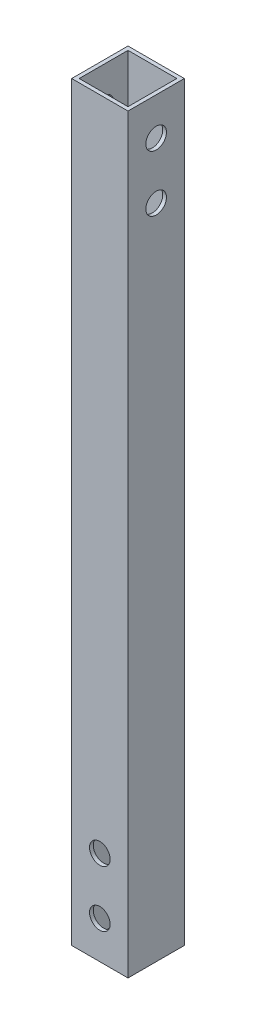
ISO-10303-21;
HEADER;
FILE_DESCRIPTION(('STEP AP214'),'2;1');
FILE_NAME('part.step','',(''),(''),'','','');
FILE_SCHEMA(('AUTOMOTIVE_DESIGN { 1 0 10303 214 1 1 1 1 }'));
ENDSEC;
DATA;
#1=APPLICATION_CONTEXT('core data for automotive mechanical design processes');
#2=APPLICATION_PROTOCOL_DEFINITION('international standard','automotive_design',2000,#1);
#3=PRODUCT_CONTEXT('',#1,'mechanical');
#4=PRODUCT('Part','Part','',(#3));
#5=PRODUCT_RELATED_PRODUCT_CATEGORY('part','',(#4));
#6=PRODUCT_DEFINITION_FORMATION('','',#4);
#7=PRODUCT_DEFINITION_CONTEXT('part definition',#1,'design');
#8=PRODUCT_DEFINITION('design','',#6,#7);
#9=PRODUCT_DEFINITION_SHAPE('','',#8);
#10=(LENGTH_UNIT() NAMED_UNIT(*) SI_UNIT(.MILLI.,.METRE.));
#11=(NAMED_UNIT(*) PLANE_ANGLE_UNIT() SI_UNIT($,.RADIAN.));
#12=(NAMED_UNIT(*) SI_UNIT($,.STERADIAN.) SOLID_ANGLE_UNIT());
#13=UNCERTAINTY_MEASURE_WITH_UNIT(LENGTH_MEASURE(1.E-05),#10,'distance_accuracy_value','');
#14=(GEOMETRIC_REPRESENTATION_CONTEXT(3) GLOBAL_UNCERTAINTY_ASSIGNED_CONTEXT((#13)) GLOBAL_UNIT_ASSIGNED_CONTEXT((#10,
#11,#12)) REPRESENTATION_CONTEXT('',''));
#15=CARTESIAN_POINT('',(0.,0.,0.));
#16=DIRECTION('',(0.,0.,1.));
#17=DIRECTION('',(1.,0.,0.));
#18=AXIS2_PLACEMENT_3D('',#15,#16,#17);
#19=CARTESIAN_POINT('',(7.5,200.,-7.5));
#20=DIRECTION('',(0.,1.,0.));
#21=DIRECTION('',(0.,0.,1.));
#22=AXIS2_PLACEMENT_3D('',#19,#20,#21);
#23=PLANE('',#22);
#24=DIRECTION('',(0.,0.,-1.));
#25=VECTOR('',#24,1.);
#26=CARTESIAN_POINT('',(7.5,200.,7.5));
#27=LINE('',#26,#25);
#28=CARTESIAN_POINT('',(7.5,200.,7.5));
#29=VERTEX_POINT('',#28);
#30=CARTESIAN_POINT('',(7.5,200.,-7.5));
#31=VERTEX_POINT('',#30);
#32=EDGE_CURVE('E156',#29,#31,#27,.T.);
#33=ORIENTED_EDGE('',*,*,#32,.T.);
#34=DIRECTION('',(-1.,0.,0.));
#35=VECTOR('',#34,1.);
#36=CARTESIAN_POINT('',(7.5,200.,-7.5));
#37=LINE('',#36,#35);
#38=CARTESIAN_POINT('',(-7.5,200.,-7.5));
#39=VERTEX_POINT('',#38);
#40=EDGE_CURVE('E160',#31,#39,#37,.T.);
#41=ORIENTED_EDGE('',*,*,#40,.T.);
#42=DIRECTION('',(0.,0.,1.));
#43=VECTOR('',#42,1.);
#44=CARTESIAN_POINT('',(-7.5,200.,7.5));
#45=LINE('',#44,#43);
#46=CARTESIAN_POINT('',(-7.5,200.,7.5));
#47=VERTEX_POINT('',#46);
#48=EDGE_CURVE('E164',#39,#47,#45,.T.);
#49=ORIENTED_EDGE('',*,*,#48,.T.);
#50=DIRECTION('',(1.,0.,0.));
#51=VECTOR('',#50,1.);
#52=CARTESIAN_POINT('',(7.5,200.,7.5));
#53=LINE('',#52,#51);
#54=EDGE_CURVE('E167',#47,#29,#53,.T.);
#55=ORIENTED_EDGE('',*,*,#54,.T.);
#56=EDGE_LOOP('',(#33,#41,#49,#55));
#57=FACE_BOUND('',#56,.T.);
#58=DIRECTION('',(1.,0.,0.));
#59=VECTOR('',#58,1.);
#60=CARTESIAN_POINT('',(6.5,200.,6.5));
#61=LINE('',#60,#59);
#62=CARTESIAN_POINT('',(-6.5,200.,6.5));
#63=VERTEX_POINT('',#62);
#64=CARTESIAN_POINT('',(6.5,200.,6.5));
#65=VERTEX_POINT('',#64);
#66=EDGE_CURVE('E114',#63,#65,#61,.T.);
#67=ORIENTED_EDGE('',*,*,#66,.F.);
#68=DIRECTION('',(0.,0.,1.));
#69=VECTOR('',#68,1.);
#70=CARTESIAN_POINT('',(-6.5,200.,6.5));
#71=LINE('',#70,#69);
#72=CARTESIAN_POINT('',(-6.5,200.,-6.5));
#73=VERTEX_POINT('',#72);
#74=EDGE_CURVE('E105',#73,#63,#71,.T.);
#75=ORIENTED_EDGE('',*,*,#74,.F.);
#76=DIRECTION('',(-1.,0.,0.));
#77=VECTOR('',#76,1.);
#78=CARTESIAN_POINT('',(6.5,200.,-6.5));
#79=LINE('',#78,#77);
#80=CARTESIAN_POINT('',(6.5,200.,-6.5));
#81=VERTEX_POINT('',#80);
#82=EDGE_CURVE('E132',#81,#73,#79,.T.);
#83=ORIENTED_EDGE('',*,*,#82,.F.);
#84=DIRECTION('',(0.,0.,-1.));
#85=VECTOR('',#84,1.);
#86=CARTESIAN_POINT('',(6.5,200.,6.5));
#87=LINE('',#86,#85);
#88=EDGE_CURVE('E127',#65,#81,#87,.T.);
#89=ORIENTED_EDGE('',*,*,#88,.F.);
#90=EDGE_LOOP('',(#67,#75,#83,#89));
#91=FACE_BOUND('',#90,.T.);
#92=ADVANCED_FACE('F17',(#57,#91),#23,.T.);
#93=CARTESIAN_POINT('',(7.5,0.,-7.5));
#94=DIRECTION('',(0.,1.,0.));
#95=DIRECTION('',(0.,0.,1.));
#96=AXIS2_PLACEMENT_3D('',#93,#94,#95);
#97=PLANE('',#96);
#98=DIRECTION('',(0.,0.,-1.));
#99=VECTOR('',#98,1.);
#100=CARTESIAN_POINT('',(7.5,0.,7.5));
#101=LINE('',#100,#99);
#102=CARTESIAN_POINT('',(7.5,0.,7.5));
#103=VERTEX_POINT('',#102);
#104=CARTESIAN_POINT('',(7.5,0.,-7.5));
#105=VERTEX_POINT('',#104);
#106=EDGE_CURVE('E123',#103,#105,#101,.T.);
#107=ORIENTED_EDGE('',*,*,#106,.F.);
#108=DIRECTION('',(1.,0.,0.));
#109=VECTOR('',#108,1.);
#110=CARTESIAN_POINT('',(7.5,0.,7.5));
#111=LINE('',#110,#109);
#112=CARTESIAN_POINT('',(-7.5,0.,7.5));
#113=VERTEX_POINT('',#112);
#114=EDGE_CURVE('E161',#113,#103,#111,.T.);
#115=ORIENTED_EDGE('',*,*,#114,.F.);
#116=DIRECTION('',(0.,0.,1.));
#117=VECTOR('',#116,1.);
#118=CARTESIAN_POINT('',(-7.5,0.,7.5));
#119=LINE('',#118,#117);
#120=CARTESIAN_POINT('',(-7.5,0.,-7.5));
#121=VERTEX_POINT('',#120);
#122=EDGE_CURVE('E177',#121,#113,#119,.T.);
#123=ORIENTED_EDGE('',*,*,#122,.F.);
#124=DIRECTION('',(-1.,0.,0.));
#125=VECTOR('',#124,1.);
#126=CARTESIAN_POINT('',(7.5,0.,-7.5));
#127=LINE('',#126,#125);
#128=EDGE_CURVE('E174',#105,#121,#127,.T.);
#129=ORIENTED_EDGE('',*,*,#128,.F.);
#130=EDGE_LOOP('',(#107,#115,#123,#129));
#131=FACE_BOUND('',#130,.T.);
#132=DIRECTION('',(0.,0.,1.));
#133=VECTOR('',#132,1.);
#134=CARTESIAN_POINT('',(-6.5,0.,6.5));
#135=LINE('',#134,#133);
#136=CARTESIAN_POINT('',(-6.5,0.,-6.5));
#137=VERTEX_POINT('',#136);
#138=CARTESIAN_POINT('',(-6.5,0.,6.5));
#139=VERTEX_POINT('',#138);
#140=EDGE_CURVE('E49',#137,#139,#135,.T.);
#141=ORIENTED_EDGE('',*,*,#140,.T.);
#142=DIRECTION('',(1.,0.,0.));
#143=VECTOR('',#142,1.);
#144=CARTESIAN_POINT('',(6.5,0.,6.5));
#145=LINE('',#144,#143);
#146=CARTESIAN_POINT('',(6.5,0.,6.5));
#147=VERTEX_POINT('',#146);
#148=EDGE_CURVE('E121',#139,#147,#145,.T.);
#149=ORIENTED_EDGE('',*,*,#148,.T.);
#150=DIRECTION('',(0.,0.,-1.));
#151=VECTOR('',#150,1.);
#152=CARTESIAN_POINT('',(6.5,0.,6.5));
#153=LINE('',#152,#151);
#154=CARTESIAN_POINT('',(6.5,0.,-6.5));
#155=VERTEX_POINT('',#154);
#156=EDGE_CURVE('E143',#147,#155,#153,.T.);
#157=ORIENTED_EDGE('',*,*,#156,.T.);
#158=DIRECTION('',(-1.,0.,0.));
#159=VECTOR('',#158,1.);
#160=CARTESIAN_POINT('',(6.5,0.,-6.5));
#161=LINE('',#160,#159);
#162=EDGE_CURVE('E115',#155,#137,#161,.T.);
#163=ORIENTED_EDGE('',*,*,#162,.T.);
#164=EDGE_LOOP('',(#141,#149,#157,#163));
#165=FACE_BOUND('',#164,.T.);
#166=ADVANCED_FACE('F269',(#131,#165),#97,.F.);
#167=CARTESIAN_POINT('',(7.5,200.,7.5));
#168=DIRECTION('',(-1.,0.,0.));
#169=DIRECTION('',(0.,0.,1.));
#170=AXIS2_PLACEMENT_3D('',#167,#168,#169);
#171=PLANE('',#170);
#172=CARTESIAN_POINT('',(7.5,175.,0.));
#173=DIRECTION('',(-1.,0.,0.));
#174=DIRECTION('',(0.,0.,1.));
#175=AXIS2_PLACEMENT_3D('',#172,#173,#174);
#176=CIRCLE('',#175,2.75);
#177=CARTESIAN_POINT('',(7.5,175.,2.75));
#178=VERTEX_POINT('',#177);
#179=EDGE_CURVE('E201',#178,#178,#176,.T.);
#180=ORIENTED_EDGE('',*,*,#179,.T.);
#181=EDGE_LOOP('',(#180));
#182=FACE_BOUND('',#181,.T.);
#183=CARTESIAN_POINT('',(7.5,190.,0.));
#184=DIRECTION('',(-1.,0.,0.));
#185=DIRECTION('',(0.,0.,1.));
#186=AXIS2_PLACEMENT_3D('',#183,#184,#185);
#187=CIRCLE('',#186,2.75);
#188=CARTESIAN_POINT('',(7.5,190.,2.75));
#189=VERTEX_POINT('',#188);
#190=EDGE_CURVE('E196',#189,#189,#187,.T.);
#191=ORIENTED_EDGE('',*,*,#190,.T.);
#192=EDGE_LOOP('',(#191));
#193=FACE_BOUND('',#192,.T.);
#194=ORIENTED_EDGE('',*,*,#106,.T.);
#195=DIRECTION('',(0.,-1.,0.));
#196=VECTOR('',#195,1.);
#197=CARTESIAN_POINT('',(7.5,200.,-7.5));
#198=LINE('',#197,#196);
#199=EDGE_CURVE('E11',#31,#105,#198,.T.);
#200=ORIENTED_EDGE('',*,*,#199,.F.);
#201=ORIENTED_EDGE('',*,*,#32,.F.);
#202=DIRECTION('',(0.,-1.,0.));
#203=VECTOR('',#202,1.);
#204=CARTESIAN_POINT('',(7.5,200.,7.5));
#205=LINE('',#204,#203);
#206=EDGE_CURVE('E170',#29,#103,#205,.T.);
#207=ORIENTED_EDGE('',*,*,#206,.T.);
#208=EDGE_LOOP('',(#194,#200,#201,#207));
#209=FACE_BOUND('',#208,.T.);
#210=ADVANCED_FACE('F19',(#182,#193,#209),#171,.F.);
#211=CARTESIAN_POINT('',(7.5,200.,-7.5));
#212=DIRECTION('',(0.,0.,1.));
#213=DIRECTION('',(1.,0.,0.));
#214=AXIS2_PLACEMENT_3D('',#211,#212,#213);
#215=PLANE('',#214);
#216=CARTESIAN_POINT('',(0.,25.,-7.5));
#217=DIRECTION('',(0.,0.,1.));
#218=DIRECTION('',(1.,0.,0.));
#219=AXIS2_PLACEMENT_3D('',#216,#217,#218);
#220=CIRCLE('',#219,2.75);
#221=CARTESIAN_POINT('',(2.75,25.,-7.5));
#222=VERTEX_POINT('',#221);
#223=EDGE_CURVE('E288',#222,#222,#220,.T.);
#224=ORIENTED_EDGE('',*,*,#223,.T.);
#225=EDGE_LOOP('',(#224));
#226=FACE_BOUND('',#225,.T.);
#227=CARTESIAN_POINT('',(0.,10.,-7.5));
#228=DIRECTION('',(0.,0.,1.));
#229=DIRECTION('',(1.,0.,0.));
#230=AXIS2_PLACEMENT_3D('',#227,#228,#229);
#231=CIRCLE('',#230,2.75);
#232=CARTESIAN_POINT('',(2.75,10.,-7.5));
#233=VERTEX_POINT('',#232);
#234=EDGE_CURVE('E206',#233,#233,#231,.T.);
#235=ORIENTED_EDGE('',*,*,#234,.T.);
#236=EDGE_LOOP('',(#235));
#237=FACE_BOUND('',#236,.T.);
#238=ORIENTED_EDGE('',*,*,#128,.T.);
#239=DIRECTION('',(0.,-1.,0.));
#240=VECTOR('',#239,1.);
#241=CARTESIAN_POINT('',(-7.5,200.,-7.5));
#242=LINE('',#241,#240);
#243=EDGE_CURVE('E27',#39,#121,#242,.T.);
#244=ORIENTED_EDGE('',*,*,#243,.F.);
#245=ORIENTED_EDGE('',*,*,#40,.F.);
#246=ORIENTED_EDGE('',*,*,#199,.T.);
#247=EDGE_LOOP('',(#238,#244,#245,#246));
#248=FACE_BOUND('',#247,.T.);
#249=ADVANCED_FACE('F278',(#226,#237,#248),#215,.F.);
#250=CARTESIAN_POINT('',(-7.5,200.,7.5));
#251=DIRECTION('',(1.,0.,0.));
#252=DIRECTION('',(0.,0.,-1.));
#253=AXIS2_PLACEMENT_3D('',#250,#251,#252);
#254=PLANE('',#253);
#255=CARTESIAN_POINT('',(-7.5,175.,0.));
#256=DIRECTION('',(-1.,0.,0.));
#257=DIRECTION('',(0.,0.,1.));
#258=AXIS2_PLACEMENT_3D('',#255,#256,#257);
#259=CIRCLE('',#258,2.75);
#260=CARTESIAN_POINT('',(-7.5,175.,2.75));
#261=VERTEX_POINT('',#260);
#262=EDGE_CURVE('E213',#261,#261,#259,.T.);
#263=ORIENTED_EDGE('',*,*,#262,.F.);
#264=EDGE_LOOP('',(#263));
#265=FACE_BOUND('',#264,.T.);
#266=CARTESIAN_POINT('',(-7.5,190.,0.));
#267=DIRECTION('',(-1.,0.,0.));
#268=DIRECTION('',(0.,0.,1.));
#269=AXIS2_PLACEMENT_3D('',#266,#267,#268);
#270=CIRCLE('',#269,2.75);
#271=CARTESIAN_POINT('',(-7.5,190.,2.75));
#272=VERTEX_POINT('',#271);
#273=EDGE_CURVE('E237',#272,#272,#270,.T.);
#274=ORIENTED_EDGE('',*,*,#273,.F.);
#275=EDGE_LOOP('',(#274));
#276=FACE_BOUND('',#275,.T.);
#277=ORIENTED_EDGE('',*,*,#122,.T.);
#278=DIRECTION('',(0.,-1.,0.));
#279=VECTOR('',#278,1.);
#280=CARTESIAN_POINT('',(-7.5,200.,7.5));
#281=LINE('',#280,#279);
#282=EDGE_CURVE('E185',#47,#113,#281,.T.);
#283=ORIENTED_EDGE('',*,*,#282,.F.);
#284=ORIENTED_EDGE('',*,*,#48,.F.);
#285=ORIENTED_EDGE('',*,*,#243,.T.);
#286=EDGE_LOOP('',(#277,#283,#284,#285));
#287=FACE_BOUND('',#286,.T.);
#288=ADVANCED_FACE('F263',(#265,#276,#287),#254,.F.);
#289=CARTESIAN_POINT('',(7.5,200.,7.5));
#290=DIRECTION('',(0.,0.,-1.));
#291=DIRECTION('',(-1.,0.,0.));
#292=AXIS2_PLACEMENT_3D('',#289,#290,#291);
#293=PLANE('',#292);
#294=CARTESIAN_POINT('',(0.,25.,7.5));
#295=DIRECTION('',(0.,0.,1.));
#296=DIRECTION('',(1.,0.,0.));
#297=AXIS2_PLACEMENT_3D('',#294,#295,#296);
#298=CIRCLE('',#297,2.75);
#299=CARTESIAN_POINT('',(2.75,25.,7.5));
#300=VERTEX_POINT('',#299);
#301=EDGE_CURVE('E343',#300,#300,#298,.T.);
#302=ORIENTED_EDGE('',*,*,#301,.F.);
#303=EDGE_LOOP('',(#302));
#304=FACE_BOUND('',#303,.T.);
#305=CARTESIAN_POINT('',(0.,10.,7.5));
#306=DIRECTION('',(0.,0.,1.));
#307=DIRECTION('',(1.,0.,0.));
#308=AXIS2_PLACEMENT_3D('',#305,#306,#307);
#309=CIRCLE('',#308,2.75);
#310=CARTESIAN_POINT('',(2.75,10.,7.5));
#311=VERTEX_POINT('',#310);
#312=EDGE_CURVE('E216',#311,#311,#309,.T.);
#313=ORIENTED_EDGE('',*,*,#312,.F.);
#314=EDGE_LOOP('',(#313));
#315=FACE_BOUND('',#314,.T.);
#316=ORIENTED_EDGE('',*,*,#114,.T.);
#317=ORIENTED_EDGE('',*,*,#206,.F.);
#318=ORIENTED_EDGE('',*,*,#54,.F.);
#319=ORIENTED_EDGE('',*,*,#282,.T.);
#320=EDGE_LOOP('',(#316,#317,#318,#319));
#321=FACE_BOUND('',#320,.T.);
#322=ADVANCED_FACE('F252',(#304,#315,#321),#293,.F.);
#323=CARTESIAN_POINT('',(-6.5,200.,6.5));
#324=DIRECTION('',(1.,0.,0.));
#325=DIRECTION('',(0.,0.,-1.));
#326=AXIS2_PLACEMENT_3D('',#323,#324,#325);
#327=PLANE('',#326);
#328=CARTESIAN_POINT('',(-6.5,175.,0.));
#329=DIRECTION('',(1.,0.,0.));
#330=DIRECTION('',(0.,0.,-1.));
#331=AXIS2_PLACEMENT_3D('',#328,#329,#330);
#332=CIRCLE('',#331,2.75);
#333=CARTESIAN_POINT('',(-6.5,175.,-2.75));
#334=VERTEX_POINT('',#333);
#335=EDGE_CURVE('E200',#334,#334,#332,.T.);
#336=ORIENTED_EDGE('',*,*,#335,.F.);
#337=EDGE_LOOP('',(#336));
#338=FACE_BOUND('',#337,.T.);
#339=CARTESIAN_POINT('',(-6.5,190.,0.));
#340=DIRECTION('',(1.,0.,0.));
#341=DIRECTION('',(0.,0.,-1.));
#342=AXIS2_PLACEMENT_3D('',#339,#340,#341);
#343=CIRCLE('',#342,2.75);
#344=CARTESIAN_POINT('',(-6.5,190.,-2.75));
#345=VERTEX_POINT('',#344);
#346=EDGE_CURVE('E140',#345,#345,#343,.T.);
#347=ORIENTED_EDGE('',*,*,#346,.F.);
#348=EDGE_LOOP('',(#347));
#349=FACE_BOUND('',#348,.T.);
#350=ORIENTED_EDGE('',*,*,#140,.F.);
#351=DIRECTION('',(0.,-1.,0.));
#352=VECTOR('',#351,1.);
#353=CARTESIAN_POINT('',(-6.5,200.,-6.5));
#354=LINE('',#353,#352);
#355=EDGE_CURVE('E109',#73,#137,#354,.T.);
#356=ORIENTED_EDGE('',*,*,#355,.F.);
#357=ORIENTED_EDGE('',*,*,#74,.T.);
#358=DIRECTION('',(0.,-1.,0.));
#359=VECTOR('',#358,1.);
#360=CARTESIAN_POINT('',(-6.5,200.,6.5));
#361=LINE('',#360,#359);
#362=EDGE_CURVE('E108',#63,#139,#361,.T.);
#363=ORIENTED_EDGE('',*,*,#362,.T.);
#364=EDGE_LOOP('',(#350,#356,#357,#363));
#365=FACE_BOUND('',#364,.T.);
#366=ADVANCED_FACE('F107',(#338,#349,#365),#327,.T.);
#367=CARTESIAN_POINT('',(6.5,200.,6.5));
#368=DIRECTION('',(0.,0.,-1.));
#369=DIRECTION('',(-1.,0.,0.));
#370=AXIS2_PLACEMENT_3D('',#367,#368,#369);
#371=PLANE('',#370);
#372=CARTESIAN_POINT('',(0.,25.,6.5));
#373=DIRECTION('',(0.,0.,-1.));
#374=DIRECTION('',(-1.,0.,0.));
#375=AXIS2_PLACEMENT_3D('',#372,#373,#374);
#376=CIRCLE('',#375,2.75);
#377=CARTESIAN_POINT('',(-2.75,25.,6.5));
#378=VERTEX_POINT('',#377);
#379=EDGE_CURVE('E223',#378,#378,#376,.T.);
#380=ORIENTED_EDGE('',*,*,#379,.F.);
#381=EDGE_LOOP('',(#380));
#382=FACE_BOUND('',#381,.T.);
#383=CARTESIAN_POINT('',(0.,10.,6.5));
#384=DIRECTION('',(0.,0.,-1.));
#385=DIRECTION('',(-1.,0.,0.));
#386=AXIS2_PLACEMENT_3D('',#383,#384,#385);
#387=CIRCLE('',#386,2.75);
#388=CARTESIAN_POINT('',(-2.75,10.,6.5));
#389=VERTEX_POINT('',#388);
#390=EDGE_CURVE('E205',#389,#389,#387,.T.);
#391=ORIENTED_EDGE('',*,*,#390,.F.);
#392=EDGE_LOOP('',(#391));
#393=FACE_BOUND('',#392,.T.);
#394=ORIENTED_EDGE('',*,*,#148,.F.);
#395=ORIENTED_EDGE('',*,*,#362,.F.);
#396=ORIENTED_EDGE('',*,*,#66,.T.);
#397=DIRECTION('',(0.,-1.,0.));
#398=VECTOR('',#397,1.);
#399=CARTESIAN_POINT('',(6.5,200.,6.5));
#400=LINE('',#399,#398);
#401=EDGE_CURVE('E124',#65,#147,#400,.T.);
#402=ORIENTED_EDGE('',*,*,#401,.T.);
#403=EDGE_LOOP('',(#394,#395,#396,#402));
#404=FACE_BOUND('',#403,.T.);
#405=ADVANCED_FACE('F118',(#382,#393,#404),#371,.T.);
#406=CARTESIAN_POINT('',(6.5,200.,6.5));
#407=DIRECTION('',(-1.,0.,0.));
#408=DIRECTION('',(0.,0.,1.));
#409=AXIS2_PLACEMENT_3D('',#406,#407,#408);
#410=PLANE('',#409);
#411=CARTESIAN_POINT('',(6.5,175.,0.));
#412=DIRECTION('',(-1.,0.,0.));
#413=DIRECTION('',(0.,0.,1.));
#414=AXIS2_PLACEMENT_3D('',#411,#412,#413);
#415=CIRCLE('',#414,2.75);
#416=CARTESIAN_POINT('',(6.5,175.,2.75));
#417=VERTEX_POINT('',#416);
#418=EDGE_CURVE('E197',#417,#417,#415,.T.);
#419=ORIENTED_EDGE('',*,*,#418,.F.);
#420=EDGE_LOOP('',(#419));
#421=FACE_BOUND('',#420,.T.);
#422=CARTESIAN_POINT('',(6.5,190.,0.));
#423=DIRECTION('',(-1.,0.,0.));
#424=DIRECTION('',(0.,0.,1.));
#425=AXIS2_PLACEMENT_3D('',#422,#423,#424);
#426=CIRCLE('',#425,2.75);
#427=CARTESIAN_POINT('',(6.5,190.,2.75));
#428=VERTEX_POINT('',#427);
#429=EDGE_CURVE('E192',#428,#428,#426,.T.);
#430=ORIENTED_EDGE('',*,*,#429,.F.);
#431=EDGE_LOOP('',(#430));
#432=FACE_BOUND('',#431,.T.);
#433=ORIENTED_EDGE('',*,*,#156,.F.);
#434=ORIENTED_EDGE('',*,*,#401,.F.);
#435=ORIENTED_EDGE('',*,*,#88,.T.);
#436=DIRECTION('',(0.,-1.,0.));
#437=VECTOR('',#436,1.);
#438=CARTESIAN_POINT('',(6.5,200.,-6.5));
#439=LINE('',#438,#437);
#440=EDGE_CURVE('E39',#81,#155,#439,.T.);
#441=ORIENTED_EDGE('',*,*,#440,.T.);
#442=EDGE_LOOP('',(#433,#434,#435,#441));
#443=FACE_BOUND('',#442,.T.);
#444=ADVANCED_FACE('F260',(#421,#432,#443),#410,.T.);
#445=CARTESIAN_POINT('',(6.5,200.,-6.5));
#446=DIRECTION('',(0.,0.,1.));
#447=DIRECTION('',(1.,0.,0.));
#448=AXIS2_PLACEMENT_3D('',#445,#446,#447);
#449=PLANE('',#448);
#450=CARTESIAN_POINT('',(0.,25.,-6.5));
#451=DIRECTION('',(0.,0.,1.));
#452=DIRECTION('',(1.,0.,0.));
#453=AXIS2_PLACEMENT_3D('',#450,#451,#452);
#454=CIRCLE('',#453,2.75);
#455=CARTESIAN_POINT('',(2.75,25.,-6.5));
#456=VERTEX_POINT('',#455);
#457=EDGE_CURVE('E21',#456,#456,#454,.T.);
#458=ORIENTED_EDGE('',*,*,#457,.F.);
#459=EDGE_LOOP('',(#458));
#460=FACE_BOUND('',#459,.T.);
#461=CARTESIAN_POINT('',(0.,10.,-6.5));
#462=DIRECTION('',(0.,0.,1.));
#463=DIRECTION('',(1.,0.,0.));
#464=AXIS2_PLACEMENT_3D('',#461,#462,#463);
#465=CIRCLE('',#464,2.75);
#466=CARTESIAN_POINT('',(2.75,10.,-6.5));
#467=VERTEX_POINT('',#466);
#468=EDGE_CURVE('E202',#467,#467,#465,.T.);
#469=ORIENTED_EDGE('',*,*,#468,.F.);
#470=EDGE_LOOP('',(#469));
#471=FACE_BOUND('',#470,.T.);
#472=ORIENTED_EDGE('',*,*,#162,.F.);
#473=ORIENTED_EDGE('',*,*,#440,.F.);
#474=ORIENTED_EDGE('',*,*,#82,.T.);
#475=ORIENTED_EDGE('',*,*,#355,.T.);
#476=EDGE_LOOP('',(#472,#473,#474,#475));
#477=FACE_BOUND('',#476,.T.);
#478=ADVANCED_FACE('F305',(#460,#471,#477),#449,.T.);
#479=CARTESIAN_POINT('',(7.5,190.,0.));
#480=DIRECTION('',(-1.,0.,0.));
#481=DIRECTION('',(0.,0.,1.));
#482=AXIS2_PLACEMENT_3D('',#479,#480,#481);
#483=CYLINDRICAL_SURFACE('',#482,2.75);
#484=ORIENTED_EDGE('',*,*,#429,.T.);
#485=EDGE_LOOP('',(#484));
#486=FACE_BOUND('',#485,.T.);
#487=ORIENTED_EDGE('',*,*,#190,.F.);
#488=EDGE_LOOP('',(#487));
#489=FACE_BOUND('',#488,.T.);
#490=ADVANCED_FACE('F307',(#486,#489),#483,.F.);
#491=ORIENTED_EDGE('',*,*,#346,.T.);
#492=EDGE_LOOP('',(#491));
#493=FACE_BOUND('',#492,.T.);
#494=ORIENTED_EDGE('',*,*,#273,.T.);
#495=EDGE_LOOP('',(#494));
#496=FACE_BOUND('',#495,.T.);
#497=ADVANCED_FACE('F248',(#493,#496),#483,.F.);
#498=CARTESIAN_POINT('',(7.5,175.,0.));
#499=DIRECTION('',(-1.,0.,0.));
#500=DIRECTION('',(0.,0.,1.));
#501=AXIS2_PLACEMENT_3D('',#498,#499,#500);
#502=CYLINDRICAL_SURFACE('',#501,2.75);
#503=ORIENTED_EDGE('',*,*,#418,.T.);
#504=EDGE_LOOP('',(#503));
#505=FACE_BOUND('',#504,.T.);
#506=ORIENTED_EDGE('',*,*,#179,.F.);
#507=EDGE_LOOP('',(#506));
#508=FACE_BOUND('',#507,.T.);
#509=ADVANCED_FACE('F321',(#505,#508),#502,.F.);
#510=ORIENTED_EDGE('',*,*,#335,.T.);
#511=EDGE_LOOP('',(#510));
#512=FACE_BOUND('',#511,.T.);
#513=ORIENTED_EDGE('',*,*,#262,.T.);
#514=EDGE_LOOP('',(#513));
#515=FACE_BOUND('',#514,.T.);
#516=ADVANCED_FACE('F324',(#512,#515),#502,.F.);
#517=CARTESIAN_POINT('',(0.,10.,-7.5));
#518=DIRECTION('',(0.,0.,1.));
#519=DIRECTION('',(1.,0.,0.));
#520=AXIS2_PLACEMENT_3D('',#517,#518,#519);
#521=CYLINDRICAL_SURFACE('',#520,2.75);
#522=ORIENTED_EDGE('',*,*,#468,.T.);
#523=EDGE_LOOP('',(#522));
#524=FACE_BOUND('',#523,.T.);
#525=ORIENTED_EDGE('',*,*,#234,.F.);
#526=EDGE_LOOP('',(#525));
#527=FACE_BOUND('',#526,.T.);
#528=ADVANCED_FACE('F326',(#524,#527),#521,.F.);
#529=ORIENTED_EDGE('',*,*,#390,.T.);
#530=EDGE_LOOP('',(#529));
#531=FACE_BOUND('',#530,.T.);
#532=ORIENTED_EDGE('',*,*,#312,.T.);
#533=EDGE_LOOP('',(#532));
#534=FACE_BOUND('',#533,.T.);
#535=ADVANCED_FACE('F329',(#531,#534),#521,.F.);
#536=CARTESIAN_POINT('',(0.,25.,-7.5));
#537=DIRECTION('',(0.,0.,1.));
#538=DIRECTION('',(1.,0.,0.));
#539=AXIS2_PLACEMENT_3D('',#536,#537,#538);
#540=CYLINDRICAL_SURFACE('',#539,2.75);
#541=ORIENTED_EDGE('',*,*,#457,.T.);
#542=EDGE_LOOP('',(#541));
#543=FACE_BOUND('',#542,.T.);
#544=ORIENTED_EDGE('',*,*,#223,.F.);
#545=EDGE_LOOP('',(#544));
#546=FACE_BOUND('',#545,.T.);
#547=ADVANCED_FACE('F330',(#543,#546),#540,.F.);
#548=ORIENTED_EDGE('',*,*,#379,.T.);
#549=EDGE_LOOP('',(#548));
#550=FACE_BOUND('',#549,.T.);
#551=ORIENTED_EDGE('',*,*,#301,.T.);
#552=EDGE_LOOP('',(#551));
#553=FACE_BOUND('',#552,.T.);
#554=ADVANCED_FACE('F332',(#550,#553),#540,.F.);
#555=CLOSED_SHELL('',(#92,#166,#210,#249,#288,#322,#366,#405,#444,#478,#490,#497,#509,#516,#528,
#535,#547,#554));
#556=MANIFOLD_SOLID_BREP('B1',#555);
#557=ADVANCED_BREP_SHAPE_REPRESENTATION('',(#18,#556),#14);
#558=SHAPE_DEFINITION_REPRESENTATION(#9,#557);
ENDSEC;
END-ISO-10303-21;
